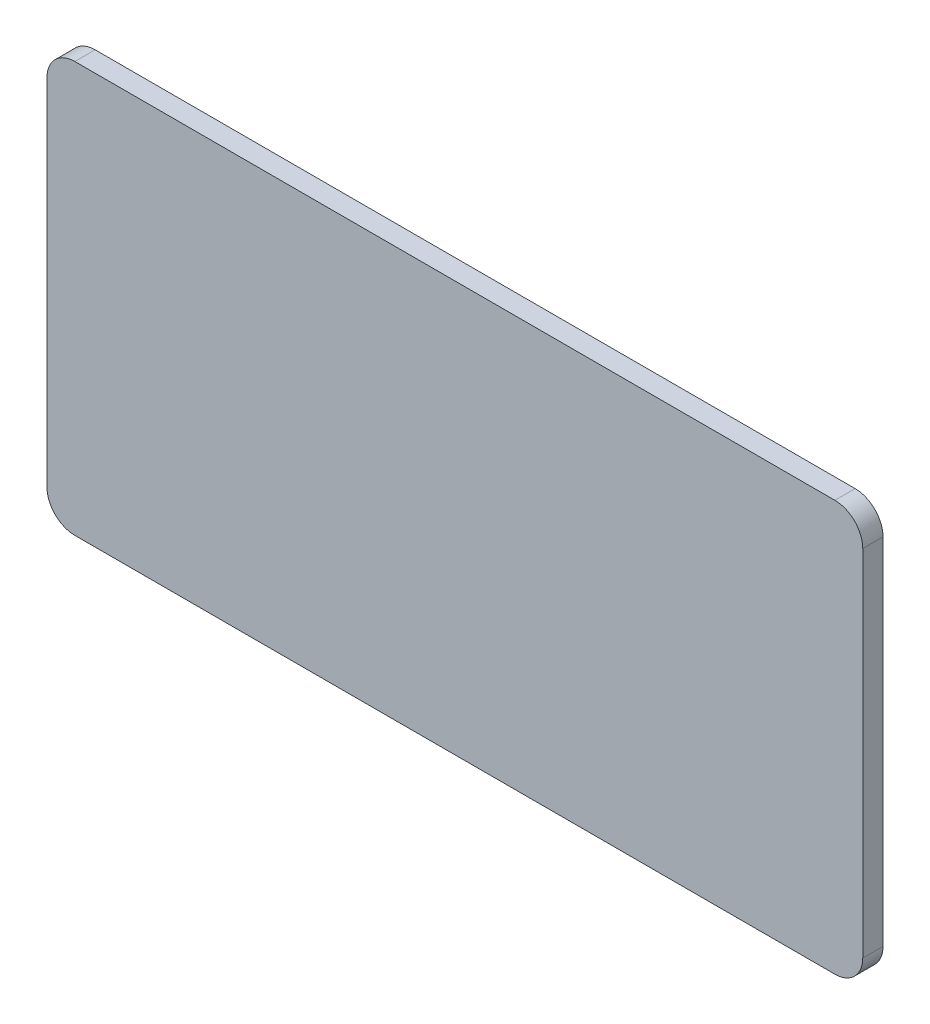
ISO-10303-21;
HEADER;
FILE_DESCRIPTION(('STEP AP214'),'2;1');
FILE_NAME('part.step','',(''),(''),'','','');
FILE_SCHEMA(('AUTOMOTIVE_DESIGN { 1 0 10303 214 1 1 1 1 }'));
ENDSEC;
DATA;
#1=APPLICATION_CONTEXT('core data for automotive mechanical design processes');
#2=APPLICATION_PROTOCOL_DEFINITION('international standard','automotive_design',2000,#1);
#3=PRODUCT_CONTEXT('',#1,'mechanical');
#4=PRODUCT('Part','Part','',(#3));
#5=PRODUCT_RELATED_PRODUCT_CATEGORY('part','',(#4));
#6=PRODUCT_DEFINITION_FORMATION('','',#4);
#7=PRODUCT_DEFINITION_CONTEXT('part definition',#1,'design');
#8=PRODUCT_DEFINITION('design','',#6,#7);
#9=PRODUCT_DEFINITION_SHAPE('','',#8);
#10=(LENGTH_UNIT() NAMED_UNIT(*) SI_UNIT(.MILLI.,.METRE.));
#11=(NAMED_UNIT(*) PLANE_ANGLE_UNIT() SI_UNIT($,.RADIAN.));
#12=(NAMED_UNIT(*) SI_UNIT($,.STERADIAN.) SOLID_ANGLE_UNIT());
#13=UNCERTAINTY_MEASURE_WITH_UNIT(LENGTH_MEASURE(1.E-05),#10,'distance_accuracy_value','');
#14=(GEOMETRIC_REPRESENTATION_CONTEXT(3) GLOBAL_UNCERTAINTY_ASSIGNED_CONTEXT((#13)) GLOBAL_UNIT_ASSIGNED_CONTEXT((#10,
#11,#12)) REPRESENTATION_CONTEXT('',''));
#15=CARTESIAN_POINT('',(0.,0.,0.));
#16=DIRECTION('',(0.,0.,1.));
#17=DIRECTION('',(1.,0.,0.));
#18=AXIS2_PLACEMENT_3D('',#15,#16,#17);
#19=CARTESIAN_POINT('',(150.,70.,0.));
#20=DIRECTION('',(0.,0.,1.));
#21=DIRECTION('',(1.,0.,0.));
#22=AXIS2_PLACEMENT_3D('',#19,#20,#21);
#23=PLANE('',#22);
#24=CARTESIAN_POINT('',(150.,70.,0.));
#25=DIRECTION('',(0.,0.,1.));
#26=DIRECTION('',(1.,0.,0.));
#27=AXIS2_PLACEMENT_3D('',#24,#25,#26);
#28=CIRCLE('',#27,11.);
#29=CARTESIAN_POINT('',(161.,70.,0.));
#30=VERTEX_POINT('',#29);
#31=CARTESIAN_POINT('',(150.,81.,0.));
#32=VERTEX_POINT('',#31);
#33=EDGE_CURVE('E115',#30,#32,#28,.T.);
#34=ORIENTED_EDGE('',*,*,#33,.F.);
#35=DIRECTION('',(0.,1.,0.));
#36=VECTOR('',#35,1.);
#37=CARTESIAN_POINT('',(161.,70.,0.));
#38=LINE('',#37,#36);
#39=CARTESIAN_POINT('',(161.,-70.,0.));
#40=VERTEX_POINT('',#39);
#41=EDGE_CURVE('E139',#40,#30,#38,.T.);
#42=ORIENTED_EDGE('',*,*,#41,.F.);
#43=CARTESIAN_POINT('',(150.,-70.,0.));
#44=DIRECTION('',(0.,0.,1.));
#45=DIRECTION('',(1.,0.,0.));
#46=AXIS2_PLACEMENT_3D('',#43,#44,#45);
#47=CIRCLE('',#46,11.);
#48=CARTESIAN_POINT('',(150.,-81.,0.));
#49=VERTEX_POINT('',#48);
#50=EDGE_CURVE('E136',#49,#40,#47,.T.);
#51=ORIENTED_EDGE('',*,*,#50,.F.);
#52=DIRECTION('',(1.,0.,0.));
#53=VECTOR('',#52,1.);
#54=CARTESIAN_POINT('',(150.,-81.,0.));
#55=LINE('',#54,#53);
#56=CARTESIAN_POINT('',(-150.,-81.,0.));
#57=VERTEX_POINT('',#56);
#58=EDGE_CURVE('E133',#57,#49,#55,.T.);
#59=ORIENTED_EDGE('',*,*,#58,.F.);
#60=CARTESIAN_POINT('',(-150.,-70.,0.));
#61=DIRECTION('',(0.,0.,1.));
#62=DIRECTION('',(1.,0.,0.));
#63=AXIS2_PLACEMENT_3D('',#60,#61,#62);
#64=CIRCLE('',#63,11.);
#65=CARTESIAN_POINT('',(-161.,-70.,0.));
#66=VERTEX_POINT('',#65);
#67=EDGE_CURVE('E130',#66,#57,#64,.T.);
#68=ORIENTED_EDGE('',*,*,#67,.F.);
#69=DIRECTION('',(0.,-1.,0.));
#70=VECTOR('',#69,1.);
#71=CARTESIAN_POINT('',(-161.,-70.,0.));
#72=LINE('',#71,#70);
#73=CARTESIAN_POINT('',(-161.,70.,0.));
#74=VERTEX_POINT('',#73);
#75=EDGE_CURVE('E127',#74,#66,#72,.T.);
#76=ORIENTED_EDGE('',*,*,#75,.F.);
#77=CARTESIAN_POINT('',(-150.,70.,0.));
#78=DIRECTION('',(0.,0.,1.));
#79=DIRECTION('',(1.,0.,0.));
#80=AXIS2_PLACEMENT_3D('',#77,#78,#79);
#81=CIRCLE('',#80,11.);
#82=CARTESIAN_POINT('',(-150.,81.0000000000001,0.));
#83=VERTEX_POINT('',#82);
#84=EDGE_CURVE('E118',#83,#74,#81,.T.);
#85=ORIENTED_EDGE('',*,*,#84,.F.);
#86=DIRECTION('',(-1.,0.,0.));
#87=VECTOR('',#86,1.);
#88=CARTESIAN_POINT('',(-150.,81.0000000000001,0.));
#89=LINE('',#88,#87);
#90=EDGE_CURVE('E107',#32,#83,#89,.T.);
#91=ORIENTED_EDGE('',*,*,#90,.F.);
#92=EDGE_LOOP('',(#34,#42,#51,#59,#68,#76,#85,#91));
#93=FACE_BOUND('',#92,.T.);
#94=ADVANCED_FACE('F39',(#93),#23,.F.);
#95=CARTESIAN_POINT('',(161.,70.,368.455267682413));
#96=DIRECTION('',(-1.,0.,0.));
#97=DIRECTION('',(0.,-1.,0.));
#98=AXIS2_PLACEMENT_3D('',#95,#96,#97);
#99=PLANE('',#98);
#100=DIRECTION('',(0.,0.,-1.));
#101=VECTOR('',#100,1.);
#102=CARTESIAN_POINT('',(161.,70.,368.455267682413));
#103=LINE('',#102,#101);
#104=CARTESIAN_POINT('',(161.,70.,8.00000000000001));
#105=VERTEX_POINT('',#104);
#106=EDGE_CURVE('E121',#105,#30,#103,.T.);
#107=ORIENTED_EDGE('',*,*,#106,.F.);
#108=DIRECTION('',(0.,-1.,0.));
#109=VECTOR('',#108,1.);
#110=CARTESIAN_POINT('',(161.,70.,8.00000000000001));
#111=LINE('',#110,#109);
#112=CARTESIAN_POINT('',(161.,-70.,8.00000000000001));
#113=VERTEX_POINT('',#112);
#114=EDGE_CURVE('E43',#105,#113,#111,.T.);
#115=ORIENTED_EDGE('',*,*,#114,.T.);
#116=DIRECTION('',(0.,0.,-1.));
#117=VECTOR('',#116,1.);
#118=CARTESIAN_POINT('',(161.,-70.,368.455267682413));
#119=LINE('',#118,#117);
#120=EDGE_CURVE('E142',#113,#40,#119,.T.);
#121=ORIENTED_EDGE('',*,*,#120,.T.);
#122=ORIENTED_EDGE('',*,*,#41,.T.);
#123=EDGE_LOOP('',(#107,#115,#121,#122));
#124=FACE_BOUND('',#123,.T.);
#125=ADVANCED_FACE('F171',(#124),#99,.F.);
#126=CARTESIAN_POINT('',(150.,-70.,368.455267682413));
#127=DIRECTION('',(0.,0.,-1.));
#128=DIRECTION('',(-1.,0.,0.));
#129=AXIS2_PLACEMENT_3D('',#126,#127,#128);
#130=CYLINDRICAL_SURFACE('',#129,11.);
#131=ORIENTED_EDGE('',*,*,#120,.F.);
#132=CARTESIAN_POINT('',(150.,-70.,8.00000000000001));
#133=DIRECTION('',(0.,0.,-1.));
#134=DIRECTION('',(0.,1.,0.));
#135=AXIS2_PLACEMENT_3D('',#132,#133,#134);
#136=CIRCLE('',#135,11.);
#137=CARTESIAN_POINT('',(150.,-81.,8.00000000000001));
#138=VERTEX_POINT('',#137);
#139=EDGE_CURVE('E165',#113,#138,#136,.T.);
#140=ORIENTED_EDGE('',*,*,#139,.T.);
#141=DIRECTION('',(0.,0.,-1.));
#142=VECTOR('',#141,1.);
#143=CARTESIAN_POINT('',(150.,-81.,368.455267682413));
#144=LINE('',#143,#142);
#145=EDGE_CURVE('E144',#138,#49,#144,.T.);
#146=ORIENTED_EDGE('',*,*,#145,.T.);
#147=ORIENTED_EDGE('',*,*,#50,.T.);
#148=EDGE_LOOP('',(#131,#140,#146,#147));
#149=FACE_BOUND('',#148,.T.);
#150=ADVANCED_FACE('F174',(#149),#130,.T.);
#151=CARTESIAN_POINT('',(150.,-81.,368.455267682413));
#152=DIRECTION('',(0.,1.,0.));
#153=DIRECTION('',(-1.,0.,0.));
#154=AXIS2_PLACEMENT_3D('',#151,#152,#153);
#155=PLANE('',#154);
#156=ORIENTED_EDGE('',*,*,#145,.F.);
#157=DIRECTION('',(-1.,0.,0.));
#158=VECTOR('',#157,1.);
#159=CARTESIAN_POINT('',(150.,-81.,8.00000000000001));
#160=LINE('',#159,#158);
#161=CARTESIAN_POINT('',(-150.,-81.,8.00000000000001));
#162=VERTEX_POINT('',#161);
#163=EDGE_CURVE('E162',#138,#162,#160,.T.);
#164=ORIENTED_EDGE('',*,*,#163,.T.);
#165=DIRECTION('',(0.,0.,-1.));
#166=VECTOR('',#165,1.);
#167=CARTESIAN_POINT('',(-150.,-81.,368.455267682413));
#168=LINE('',#167,#166);
#169=EDGE_CURVE('E146',#162,#57,#168,.T.);
#170=ORIENTED_EDGE('',*,*,#169,.T.);
#171=ORIENTED_EDGE('',*,*,#58,.T.);
#172=EDGE_LOOP('',(#156,#164,#170,#171));
#173=FACE_BOUND('',#172,.T.);
#174=ADVANCED_FACE('F179',(#173),#155,.F.);
#175=CARTESIAN_POINT('',(-150.,-70.,368.455267682413));
#176=DIRECTION('',(0.,0.,-1.));
#177=DIRECTION('',(-1.,0.,0.));
#178=AXIS2_PLACEMENT_3D('',#175,#176,#177);
#179=CYLINDRICAL_SURFACE('',#178,11.);
#180=ORIENTED_EDGE('',*,*,#169,.F.);
#181=CARTESIAN_POINT('',(-150.,-70.,8.00000000000001));
#182=DIRECTION('',(0.,0.,-1.));
#183=DIRECTION('',(0.,1.,0.));
#184=AXIS2_PLACEMENT_3D('',#181,#182,#183);
#185=CIRCLE('',#184,11.);
#186=CARTESIAN_POINT('',(-161.,-70.,8.00000000000001));
#187=VERTEX_POINT('',#186);
#188=EDGE_CURVE('E157',#162,#187,#185,.T.);
#189=ORIENTED_EDGE('',*,*,#188,.T.);
#190=DIRECTION('',(0.,0.,-1.));
#191=VECTOR('',#190,1.);
#192=CARTESIAN_POINT('',(-161.,-70.,368.455267682413));
#193=LINE('',#192,#191);
#194=EDGE_CURVE('E148',#187,#66,#193,.T.);
#195=ORIENTED_EDGE('',*,*,#194,.T.);
#196=ORIENTED_EDGE('',*,*,#67,.T.);
#197=EDGE_LOOP('',(#180,#189,#195,#196));
#198=FACE_BOUND('',#197,.T.);
#199=ADVANCED_FACE('F182',(#198),#179,.T.);
#200=CARTESIAN_POINT('',(-161.,-70.,368.455267682413));
#201=DIRECTION('',(1.,0.,0.));
#202=DIRECTION('',(0.,1.,0.));
#203=AXIS2_PLACEMENT_3D('',#200,#201,#202);
#204=PLANE('',#203);
#205=ORIENTED_EDGE('',*,*,#194,.F.);
#206=DIRECTION('',(0.,1.,0.));
#207=VECTOR('',#206,1.);
#208=CARTESIAN_POINT('',(-161.,-70.,8.00000000000001));
#209=LINE('',#208,#207);
#210=CARTESIAN_POINT('',(-161.,70.,7.99999999999999));
#211=VERTEX_POINT('',#210);
#212=EDGE_CURVE('E155',#187,#211,#209,.T.);
#213=ORIENTED_EDGE('',*,*,#212,.T.);
#214=DIRECTION('',(0.,0.,-1.));
#215=VECTOR('',#214,1.);
#216=CARTESIAN_POINT('',(-161.,70.,368.455267682413));
#217=LINE('',#216,#215);
#218=EDGE_CURVE('E150',#211,#74,#217,.T.);
#219=ORIENTED_EDGE('',*,*,#218,.T.);
#220=ORIENTED_EDGE('',*,*,#75,.T.);
#221=EDGE_LOOP('',(#205,#213,#219,#220));
#222=FACE_BOUND('',#221,.T.);
#223=ADVANCED_FACE('F185',(#222),#204,.F.);
#224=CARTESIAN_POINT('',(-150.,70.,368.455267682413));
#225=DIRECTION('',(0.,0.,-1.));
#226=DIRECTION('',(-1.,0.,0.));
#227=AXIS2_PLACEMENT_3D('',#224,#225,#226);
#228=CYLINDRICAL_SURFACE('',#227,11.);
#229=ORIENTED_EDGE('',*,*,#218,.F.);
#230=CARTESIAN_POINT('',(-150.,70.,8.00000000000001));
#231=DIRECTION('',(0.,0.,-1.));
#232=DIRECTION('',(0.,1.,0.));
#233=AXIS2_PLACEMENT_3D('',#230,#231,#232);
#234=CIRCLE('',#233,11.);
#235=CARTESIAN_POINT('',(-150.,81.0000000000001,8.00000000000001));
#236=VERTEX_POINT('',#235);
#237=EDGE_CURVE('E60',#211,#236,#234,.T.);
#238=ORIENTED_EDGE('',*,*,#237,.T.);
#239=DIRECTION('',(0.,0.,-1.));
#240=VECTOR('',#239,1.);
#241=CARTESIAN_POINT('',(-150.,81.0000000000001,368.455267682413));
#242=LINE('',#241,#240);
#243=EDGE_CURVE('E111',#236,#83,#242,.T.);
#244=ORIENTED_EDGE('',*,*,#243,.T.);
#245=ORIENTED_EDGE('',*,*,#84,.T.);
#246=EDGE_LOOP('',(#229,#238,#244,#245));
#247=FACE_BOUND('',#246,.T.);
#248=ADVANCED_FACE('F153',(#247),#228,.T.);
#249=CARTESIAN_POINT('',(-150.,81.0000000000001,368.455267682413));
#250=DIRECTION('',(0.,-1.,0.));
#251=DIRECTION('',(1.,0.,0.));
#252=AXIS2_PLACEMENT_3D('',#249,#250,#251);
#253=PLANE('',#252);
#254=ORIENTED_EDGE('',*,*,#243,.F.);
#255=DIRECTION('',(1.,0.,0.));
#256=VECTOR('',#255,1.);
#257=CARTESIAN_POINT('',(-150.,81.0000000000001,8.00000000000001));
#258=LINE('',#257,#256);
#259=CARTESIAN_POINT('',(150.,81.,8.00000000000001));
#260=VERTEX_POINT('',#259);
#261=EDGE_CURVE('E48',#236,#260,#258,.T.);
#262=ORIENTED_EDGE('',*,*,#261,.T.);
#263=DIRECTION('',(0.,0.,-1.));
#264=VECTOR('',#263,1.);
#265=CARTESIAN_POINT('',(150.,81.,368.455267682413));
#266=LINE('',#265,#264);
#267=EDGE_CURVE('E104',#260,#32,#266,.T.);
#268=ORIENTED_EDGE('',*,*,#267,.T.);
#269=ORIENTED_EDGE('',*,*,#90,.T.);
#270=EDGE_LOOP('',(#254,#262,#268,#269));
#271=FACE_BOUND('',#270,.T.);
#272=ADVANCED_FACE('F106',(#271),#253,.F.);
#273=CARTESIAN_POINT('',(150.,70.,368.455267682413));
#274=DIRECTION('',(0.,0.,-1.));
#275=DIRECTION('',(-1.,0.,0.));
#276=AXIS2_PLACEMENT_3D('',#273,#274,#275);
#277=CYLINDRICAL_SURFACE('',#276,11.);
#278=ORIENTED_EDGE('',*,*,#267,.F.);
#279=CARTESIAN_POINT('',(150.,70.,8.00000000000001));
#280=DIRECTION('',(0.,0.,-1.));
#281=DIRECTION('',(0.,1.,0.));
#282=AXIS2_PLACEMENT_3D('',#279,#280,#281);
#283=CIRCLE('',#282,11.);
#284=EDGE_CURVE('E11',#260,#105,#283,.T.);
#285=ORIENTED_EDGE('',*,*,#284,.T.);
#286=ORIENTED_EDGE('',*,*,#106,.T.);
#287=ORIENTED_EDGE('',*,*,#33,.T.);
#288=EDGE_LOOP('',(#278,#285,#286,#287));
#289=FACE_BOUND('',#288,.T.);
#290=ADVANCED_FACE('F41',(#289),#277,.T.);
#291=CARTESIAN_POINT('',(0.,121.,8.));
#292=DIRECTION('',(0.,0.,-1.));
#293=DIRECTION('',(0.,-1.,0.));
#294=AXIS2_PLACEMENT_3D('',#291,#292,#293);
#295=PLANE('',#294);
#296=ORIENTED_EDGE('',*,*,#261,.F.);
#297=ORIENTED_EDGE('',*,*,#237,.F.);
#298=ORIENTED_EDGE('',*,*,#212,.F.);
#299=ORIENTED_EDGE('',*,*,#188,.F.);
#300=ORIENTED_EDGE('',*,*,#163,.F.);
#301=ORIENTED_EDGE('',*,*,#139,.F.);
#302=ORIENTED_EDGE('',*,*,#114,.F.);
#303=ORIENTED_EDGE('',*,*,#284,.F.);
#304=EDGE_LOOP('',(#296,#297,#298,#299,#300,#301,#302,#303));
#305=FACE_BOUND('',#304,.T.);
#306=ADVANCED_FACE('F172',(#305),#295,.F.);
#307=CLOSED_SHELL('',(#94,#125,#150,#174,#199,#223,#248,#272,#290,#306));
#308=MANIFOLD_SOLID_BREP('B2',#307);
#309=ADVANCED_BREP_SHAPE_REPRESENTATION('',(#18,#308),#14);
#310=SHAPE_DEFINITION_REPRESENTATION(#9,#309);
ENDSEC;
END-ISO-10303-21;
